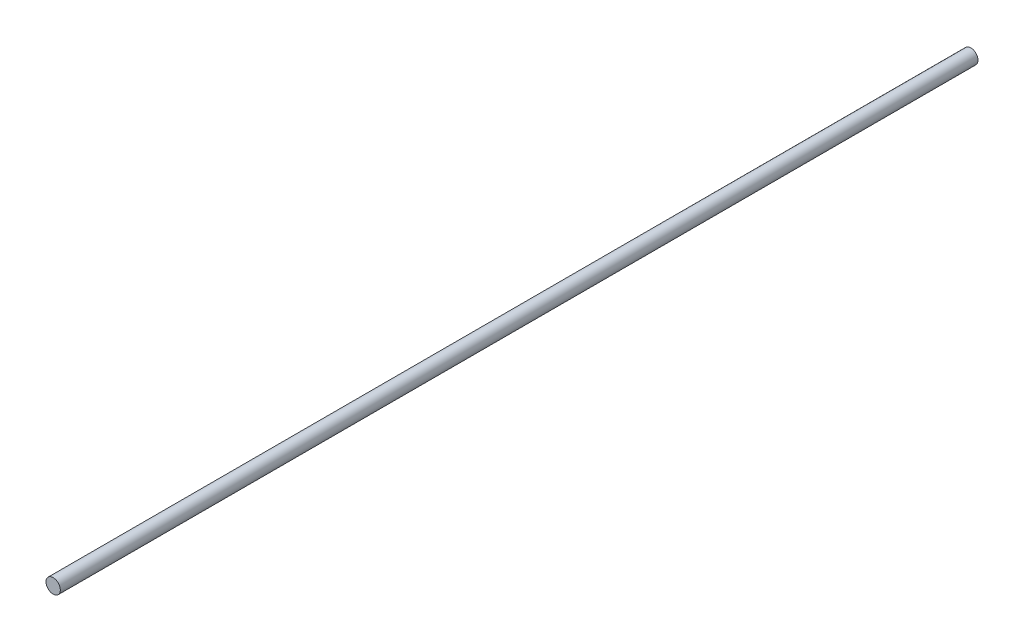
ISO-10303-21;
HEADER;
FILE_DESCRIPTION(('STEP AP214'),'2;1');
FILE_NAME('part.step','',(''),(''),'','','');
FILE_SCHEMA(('AUTOMOTIVE_DESIGN { 1 0 10303 214 1 1 1 1 }'));
ENDSEC;
DATA;
#1=APPLICATION_CONTEXT('core data for automotive mechanical design processes');
#2=APPLICATION_PROTOCOL_DEFINITION('international standard','automotive_design',2000,#1);
#3=PRODUCT_CONTEXT('',#1,'mechanical');
#4=PRODUCT('Part','Part','',(#3));
#5=PRODUCT_RELATED_PRODUCT_CATEGORY('part','',(#4));
#6=PRODUCT_DEFINITION_FORMATION('','',#4);
#7=PRODUCT_DEFINITION_CONTEXT('part definition',#1,'design');
#8=PRODUCT_DEFINITION('design','',#6,#7);
#9=PRODUCT_DEFINITION_SHAPE('','',#8);
#10=(LENGTH_UNIT() NAMED_UNIT(*) SI_UNIT(.MILLI.,.METRE.));
#11=(NAMED_UNIT(*) PLANE_ANGLE_UNIT() SI_UNIT($,.RADIAN.));
#12=(NAMED_UNIT(*) SI_UNIT($,.STERADIAN.) SOLID_ANGLE_UNIT());
#13=UNCERTAINTY_MEASURE_WITH_UNIT(LENGTH_MEASURE(1.E-05),#10,'distance_accuracy_value','');
#14=(GEOMETRIC_REPRESENTATION_CONTEXT(3) GLOBAL_UNCERTAINTY_ASSIGNED_CONTEXT((#13)) GLOBAL_UNIT_ASSIGNED_CONTEXT((#10,
#11,#12)) REPRESENTATION_CONTEXT('',''));
#15=CARTESIAN_POINT('',(0.,0.,0.));
#16=DIRECTION('',(0.,0.,1.));
#17=DIRECTION('',(1.,0.,0.));
#18=AXIS2_PLACEMENT_3D('',#15,#16,#17);
#19=CARTESIAN_POINT('',(0.,0.,320.));
#20=DIRECTION('',(0.,0.,-1.));
#21=DIRECTION('',(-1.,0.,0.));
#22=AXIS2_PLACEMENT_3D('',#19,#20,#21);
#23=CYLINDRICAL_SURFACE('',#22,2.5);
#24=CARTESIAN_POINT('',(0.,0.,320.));
#25=DIRECTION('',(0.,0.,1.));
#26=DIRECTION('',(1.,0.,0.));
#27=AXIS2_PLACEMENT_3D('',#24,#25,#26);
#28=CIRCLE('',#27,2.5);
#29=CARTESIAN_POINT('',(2.5,0.,320.));
#30=VERTEX_POINT('',#29);
#31=EDGE_CURVE('E10',#30,#30,#28,.T.);
#32=ORIENTED_EDGE('',*,*,#31,.F.);
#33=EDGE_LOOP('',(#32));
#34=FACE_BOUND('',#33,.T.);
#35=CARTESIAN_POINT('',(0.,0.,0.));
#36=DIRECTION('',(0.,0.,1.));
#37=DIRECTION('',(1.,0.,0.));
#38=AXIS2_PLACEMENT_3D('',#35,#36,#37);
#39=CIRCLE('',#38,2.5);
#40=CARTESIAN_POINT('',(2.5,0.,0.));
#41=VERTEX_POINT('',#40);
#42=EDGE_CURVE('E38',#41,#41,#39,.T.);
#43=ORIENTED_EDGE('',*,*,#42,.T.);
#44=EDGE_LOOP('',(#43));
#45=FACE_BOUND('',#44,.T.);
#46=ADVANCED_FACE('F35',(#34,#45),#23,.T.);
#47=CARTESIAN_POINT('',(0.,0.,320.));
#48=DIRECTION('',(0.,0.,1.));
#49=DIRECTION('',(1.,0.,0.));
#50=AXIS2_PLACEMENT_3D('',#47,#48,#49);
#51=PLANE('',#50);
#52=ORIENTED_EDGE('',*,*,#31,.T.);
#53=EDGE_LOOP('',(#52));
#54=FACE_BOUND('',#53,.T.);
#55=ADVANCED_FACE('F50',(#54),#51,.T.);
#56=CARTESIAN_POINT('',(0.,0.,0.));
#57=DIRECTION('',(0.,0.,1.));
#58=DIRECTION('',(1.,0.,0.));
#59=AXIS2_PLACEMENT_3D('',#56,#57,#58);
#60=PLANE('',#59);
#61=ORIENTED_EDGE('',*,*,#42,.F.);
#62=EDGE_LOOP('',(#61));
#63=FACE_BOUND('',#62,.T.);
#64=ADVANCED_FACE('F48',(#63),#60,.F.);
#65=CLOSED_SHELL('',(#46,#55,#64));
#66=MANIFOLD_SOLID_BREP('B2',#65);
#67=ADVANCED_BREP_SHAPE_REPRESENTATION('',(#18,#66),#14);
#68=SHAPE_DEFINITION_REPRESENTATION(#9,#67);
ENDSEC;
END-ISO-10303-21;
